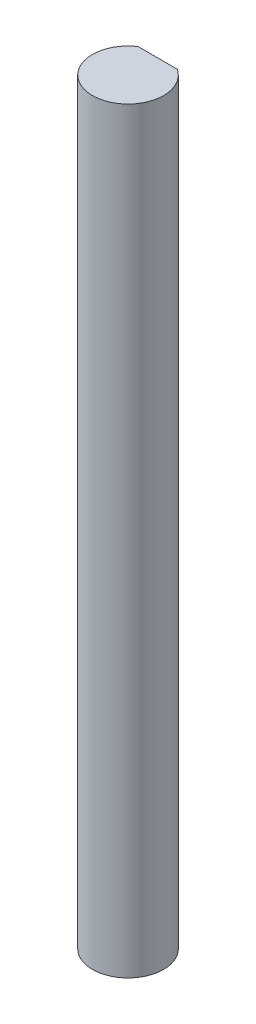
ISO-10303-21;
HEADER;
FILE_DESCRIPTION(('STEP AP214'),'2;1');
FILE_NAME('part.step','',(''),(''),'','','');
FILE_SCHEMA(('AUTOMOTIVE_DESIGN { 1 0 10303 214 1 1 1 1 }'));
ENDSEC;
DATA;
#1=APPLICATION_CONTEXT('core data for automotive mechanical design processes');
#2=APPLICATION_PROTOCOL_DEFINITION('international standard','automotive_design',2000,#1);
#3=PRODUCT_CONTEXT('',#1,'mechanical');
#4=PRODUCT('Part','Part','',(#3));
#5=PRODUCT_RELATED_PRODUCT_CATEGORY('part','',(#4));
#6=PRODUCT_DEFINITION_FORMATION('','',#4);
#7=PRODUCT_DEFINITION_CONTEXT('part definition',#1,'design');
#8=PRODUCT_DEFINITION('design','',#6,#7);
#9=PRODUCT_DEFINITION_SHAPE('','',#8);
#10=(LENGTH_UNIT() NAMED_UNIT(*) SI_UNIT(.MILLI.,.METRE.));
#11=(NAMED_UNIT(*) PLANE_ANGLE_UNIT() SI_UNIT($,.RADIAN.));
#12=(NAMED_UNIT(*) SI_UNIT($,.STERADIAN.) SOLID_ANGLE_UNIT());
#13=UNCERTAINTY_MEASURE_WITH_UNIT(LENGTH_MEASURE(1.E-05),#10,'distance_accuracy_value','');
#14=(GEOMETRIC_REPRESENTATION_CONTEXT(3) GLOBAL_UNCERTAINTY_ASSIGNED_CONTEXT((#13)) GLOBAL_UNIT_ASSIGNED_CONTEXT((#10,
#11,#12)) REPRESENTATION_CONTEXT('',''));
#15=CARTESIAN_POINT('',(0.,0.,0.));
#16=DIRECTION('',(0.,0.,1.));
#17=DIRECTION('',(1.,0.,0.));
#18=AXIS2_PLACEMENT_3D('',#15,#16,#17);
#19=CARTESIAN_POINT('',(0.,89.7,0.));
#20=DIRECTION('',(0.,1.,0.));
#21=DIRECTION('',(0.,0.,1.));
#22=AXIS2_PLACEMENT_3D('',#19,#20,#21);
#23=CYLINDRICAL_SURFACE('',#22,3.);
#24=CARTESIAN_POINT('',(0.,153.509095094932,0.));
#25=DIRECTION('',(0.,1.,0.));
#26=DIRECTION('',(0.,0.,1.));
#27=AXIS2_PLACEMENT_3D('',#24,#25,#26);
#28=CIRCLE('',#27,3.);
#29=CARTESIAN_POINT('',(-1.6583123951777,153.509095094932,-2.5));
#30=VERTEX_POINT('',#29);
#31=CARTESIAN_POINT('',(1.6583123951777,153.509095094932,-2.5));
#32=VERTEX_POINT('',#31);
#33=EDGE_CURVE('E77',#30,#32,#28,.T.);
#34=ORIENTED_EDGE('',*,*,#33,.F.);
#35=DIRECTION('',(0.,1.,0.));
#36=VECTOR('',#35,1.);
#37=CARTESIAN_POINT('',(-1.6583123951777,89.7,-2.5));
#38=LINE('',#37,#36);
#39=CARTESIAN_POINT('',(-1.6583123951777,89.7,-2.5));
#40=VERTEX_POINT('',#39);
#41=EDGE_CURVE('E11',#40,#30,#38,.T.);
#42=ORIENTED_EDGE('',*,*,#41,.F.);
#43=CARTESIAN_POINT('',(0.,89.7,0.));
#44=DIRECTION('',(0.,1.,0.));
#45=DIRECTION('',(0.,0.,1.));
#46=AXIS2_PLACEMENT_3D('',#43,#44,#45);
#47=CIRCLE('',#46,3.);
#48=CARTESIAN_POINT('',(1.6583123951777,89.7,-2.5));
#49=VERTEX_POINT('',#48);
#50=EDGE_CURVE('E79',#40,#49,#47,.T.);
#51=ORIENTED_EDGE('',*,*,#50,.T.);
#52=DIRECTION('',(0.,1.,0.));
#53=VECTOR('',#52,1.);
#54=CARTESIAN_POINT('',(1.6583123951777,89.7,-2.5));
#55=LINE('',#54,#53);
#56=EDGE_CURVE('E48',#49,#32,#55,.T.);
#57=ORIENTED_EDGE('',*,*,#56,.T.);
#58=EDGE_LOOP('',(#34,#42,#51,#57));
#59=FACE_BOUND('',#58,.T.);
#60=ADVANCED_FACE('F45',(#59),#23,.T.);
#61=CARTESIAN_POINT('',(0.,89.7,-2.5));
#62=DIRECTION('',(0.,0.,1.));
#63=DIRECTION('',(1.,0.,0.));
#64=AXIS2_PLACEMENT_3D('',#61,#62,#63);
#65=PLANE('',#64);
#66=DIRECTION('',(1.,0.,0.));
#67=VECTOR('',#66,1.);
#68=CARTESIAN_POINT('',(0.,153.509095094932,-2.5));
#69=LINE('',#68,#67);
#70=EDGE_CURVE('E71',#30,#32,#69,.T.);
#71=ORIENTED_EDGE('',*,*,#70,.T.);
#72=ORIENTED_EDGE('',*,*,#56,.F.);
#73=DIRECTION('',(1.,0.,0.));
#74=VECTOR('',#73,1.);
#75=CARTESIAN_POINT('',(0.,89.7,-2.5));
#76=LINE('',#75,#74);
#77=EDGE_CURVE('E73',#40,#49,#76,.T.);
#78=ORIENTED_EDGE('',*,*,#77,.F.);
#79=ORIENTED_EDGE('',*,*,#41,.T.);
#80=EDGE_LOOP('',(#71,#72,#78,#79));
#81=FACE_BOUND('',#80,.T.);
#82=ADVANCED_FACE('F70',(#81),#65,.F.);
#83=CARTESIAN_POINT('',(0.,89.7,0.));
#84=DIRECTION('',(0.,1.,0.));
#85=DIRECTION('',(0.,0.,1.));
#86=AXIS2_PLACEMENT_3D('',#83,#84,#85);
#87=PLANE('',#86);
#88=ORIENTED_EDGE('',*,*,#50,.F.);
#89=ORIENTED_EDGE('',*,*,#77,.T.);
#90=EDGE_LOOP('',(#88,#89));
#91=FACE_BOUND('',#90,.T.);
#92=ADVANCED_FACE('F88',(#91),#87,.F.);
#93=CARTESIAN_POINT('',(0.,153.509095094932,0.));
#94=DIRECTION('',(0.,1.,0.));
#95=DIRECTION('',(0.,0.,1.));
#96=AXIS2_PLACEMENT_3D('',#93,#94,#95);
#97=PLANE('',#96);
#98=ORIENTED_EDGE('',*,*,#33,.T.);
#99=ORIENTED_EDGE('',*,*,#70,.F.);
#100=EDGE_LOOP('',(#98,#99));
#101=FACE_BOUND('',#100,.T.);
#102=ADVANCED_FACE('F76',(#101),#97,.T.);
#103=CLOSED_SHELL('',(#60,#82,#92,#102));
#104=MANIFOLD_SOLID_BREP('B2',#103);
#105=ADVANCED_BREP_SHAPE_REPRESENTATION('',(#18,#104),#14);
#106=SHAPE_DEFINITION_REPRESENTATION(#9,#105);
ENDSEC;
END-ISO-10303-21;
